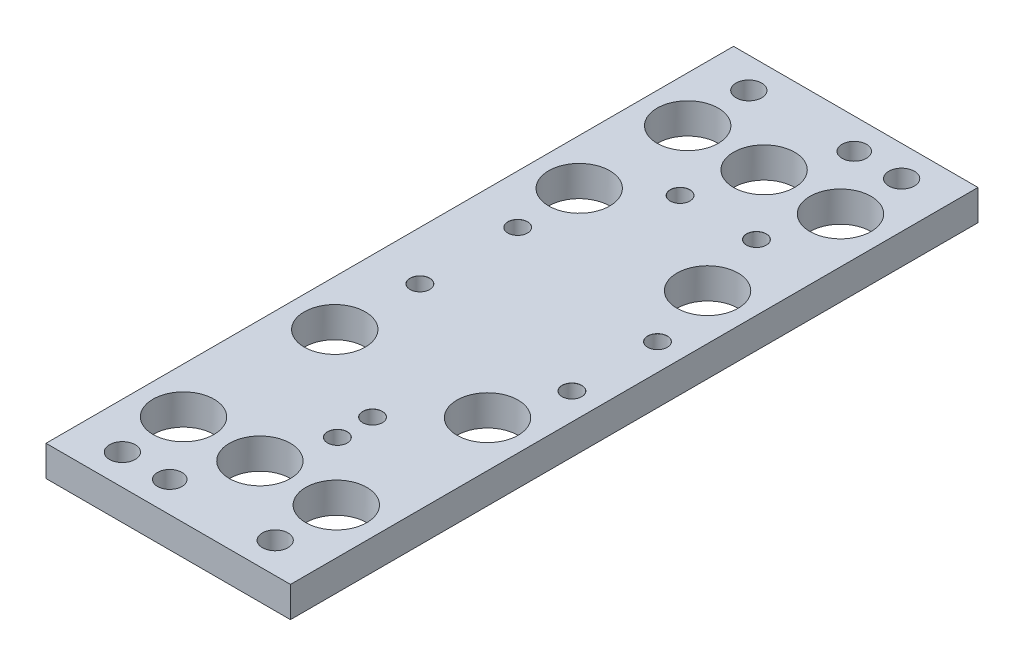
ISO-10303-21;
HEADER;
FILE_DESCRIPTION(('STEP AP214'),'2;1');
FILE_NAME('part.step','',(''),(''),'','','');
FILE_SCHEMA(('AUTOMOTIVE_DESIGN { 1 0 10303 214 1 1 1 1 }'));
ENDSEC;
DATA;
#1=APPLICATION_CONTEXT('core data for automotive mechanical design processes');
#2=APPLICATION_PROTOCOL_DEFINITION('international standard','automotive_design',2000,#1);
#3=PRODUCT_CONTEXT('',#1,'mechanical');
#4=PRODUCT('Part','Part','',(#3));
#5=PRODUCT_RELATED_PRODUCT_CATEGORY('part','',(#4));
#6=PRODUCT_DEFINITION_FORMATION('','',#4);
#7=PRODUCT_DEFINITION_CONTEXT('part definition',#1,'design');
#8=PRODUCT_DEFINITION('design','',#6,#7);
#9=PRODUCT_DEFINITION_SHAPE('','',#8);
#10=(LENGTH_UNIT() NAMED_UNIT(*) SI_UNIT(.MILLI.,.METRE.));
#11=(NAMED_UNIT(*) PLANE_ANGLE_UNIT() SI_UNIT($,.RADIAN.));
#12=(NAMED_UNIT(*) SI_UNIT($,.STERADIAN.) SOLID_ANGLE_UNIT());
#13=UNCERTAINTY_MEASURE_WITH_UNIT(LENGTH_MEASURE(1.E-05),#10,'distance_accuracy_value','');
#14=(GEOMETRIC_REPRESENTATION_CONTEXT(3) GLOBAL_UNCERTAINTY_ASSIGNED_CONTEXT((#13)) GLOBAL_UNIT_ASSIGNED_CONTEXT((#10,
#11,#12)) REPRESENTATION_CONTEXT('',''));
#15=CARTESIAN_POINT('',(0.,0.,0.));
#16=DIRECTION('',(0.,0.,1.));
#17=DIRECTION('',(1.,0.,0.));
#18=AXIS2_PLACEMENT_3D('',#15,#16,#17);
#19=CARTESIAN_POINT('',(40.,-10.,112.5));
#20=DIRECTION('',(1.,0.,0.));
#21=DIRECTION('',(0.,0.,-1.));
#22=AXIS2_PLACEMENT_3D('',#19,#20,#21);
#23=PLANE('',#22);
#24=DIRECTION('',(0.,0.,-1.));
#25=VECTOR('',#24,1.);
#26=CARTESIAN_POINT('',(40.,0.,112.5));
#27=LINE('',#26,#25);
#28=CARTESIAN_POINT('',(40.,0.,112.5));
#29=VERTEX_POINT('',#28);
#30=CARTESIAN_POINT('',(40.,0.,-112.5));
#31=VERTEX_POINT('',#30);
#32=EDGE_CURVE('E105',#29,#31,#27,.T.);
#33=ORIENTED_EDGE('',*,*,#32,.F.);
#34=DIRECTION('',(0.,1.,0.));
#35=VECTOR('',#34,1.);
#36=CARTESIAN_POINT('',(40.,-10.,112.5));
#37=LINE('',#36,#35);
#38=CARTESIAN_POINT('',(40.,-10.,112.5));
#39=VERTEX_POINT('',#38);
#40=EDGE_CURVE('E11',#39,#29,#37,.T.);
#41=ORIENTED_EDGE('',*,*,#40,.F.);
#42=DIRECTION('',(0.,0.,-1.));
#43=VECTOR('',#42,1.);
#44=CARTESIAN_POINT('',(40.,-10.,112.5));
#45=LINE('',#44,#43);
#46=CARTESIAN_POINT('',(40.,-10.,-112.5));
#47=VERTEX_POINT('',#46);
#48=EDGE_CURVE('E98',#39,#47,#45,.T.);
#49=ORIENTED_EDGE('',*,*,#48,.T.);
#50=DIRECTION('',(0.,1.,0.));
#51=VECTOR('',#50,1.);
#52=CARTESIAN_POINT('',(40.,-10.,-112.5));
#53=LINE('',#52,#51);
#54=EDGE_CURVE('E43',#47,#31,#53,.T.);
#55=ORIENTED_EDGE('',*,*,#54,.T.);
#56=EDGE_LOOP('',(#33,#41,#49,#55));
#57=FACE_BOUND('',#56,.T.);
#58=ADVANCED_FACE('F40',(#57),#23,.T.);
#59=CARTESIAN_POINT('',(-40.,-10.,112.5));
#60=DIRECTION('',(0.,0.,1.));
#61=DIRECTION('',(1.,0.,0.));
#62=AXIS2_PLACEMENT_3D('',#59,#60,#61);
#63=PLANE('',#62);
#64=DIRECTION('',(1.,0.,0.));
#65=VECTOR('',#64,1.);
#66=CARTESIAN_POINT('',(-40.,0.,112.5));
#67=LINE('',#66,#65);
#68=CARTESIAN_POINT('',(-40.,0.,112.5));
#69=VERTEX_POINT('',#68);
#70=EDGE_CURVE('E100',#69,#29,#67,.T.);
#71=ORIENTED_EDGE('',*,*,#70,.F.);
#72=DIRECTION('',(0.,1.,0.));
#73=VECTOR('',#72,1.);
#74=CARTESIAN_POINT('',(-40.,-10.,112.5));
#75=LINE('',#74,#73);
#76=CARTESIAN_POINT('',(-40.,-10.,112.5));
#77=VERTEX_POINT('',#76);
#78=EDGE_CURVE('E49',#77,#69,#75,.T.);
#79=ORIENTED_EDGE('',*,*,#78,.F.);
#80=DIRECTION('',(1.,0.,0.));
#81=VECTOR('',#80,1.);
#82=CARTESIAN_POINT('',(-40.,-10.,112.5));
#83=LINE('',#82,#81);
#84=EDGE_CURVE('E95',#77,#39,#83,.T.);
#85=ORIENTED_EDGE('',*,*,#84,.T.);
#86=ORIENTED_EDGE('',*,*,#40,.T.);
#87=EDGE_LOOP('',(#71,#79,#85,#86));
#88=FACE_BOUND('',#87,.T.);
#89=ADVANCED_FACE('F116',(#88),#63,.T.);
#90=CARTESIAN_POINT('',(-40.,-10.,112.5));
#91=DIRECTION('',(-1.,0.,0.));
#92=DIRECTION('',(0.,0.,1.));
#93=AXIS2_PLACEMENT_3D('',#90,#91,#92);
#94=PLANE('',#93);
#95=DIRECTION('',(0.,0.,1.));
#96=VECTOR('',#95,1.);
#97=CARTESIAN_POINT('',(-40.,0.,112.5));
#98=LINE('',#97,#96);
#99=CARTESIAN_POINT('',(-40.,0.,-112.5));
#100=VERTEX_POINT('',#99);
#101=EDGE_CURVE('E90',#100,#69,#98,.T.);
#102=ORIENTED_EDGE('',*,*,#101,.F.);
#103=DIRECTION('',(0.,1.,0.));
#104=VECTOR('',#103,1.);
#105=CARTESIAN_POINT('',(-40.,-10.,-112.5));
#106=LINE('',#105,#104);
#107=CARTESIAN_POINT('',(-40.,-10.,-112.5));
#108=VERTEX_POINT('',#107);
#109=EDGE_CURVE('E85',#108,#100,#106,.T.);
#110=ORIENTED_EDGE('',*,*,#109,.F.);
#111=DIRECTION('',(0.,0.,1.));
#112=VECTOR('',#111,1.);
#113=CARTESIAN_POINT('',(-40.,-10.,112.5));
#114=LINE('',#113,#112);
#115=EDGE_CURVE('E88',#108,#77,#114,.T.);
#116=ORIENTED_EDGE('',*,*,#115,.T.);
#117=ORIENTED_EDGE('',*,*,#78,.T.);
#118=EDGE_LOOP('',(#102,#110,#116,#117));
#119=FACE_BOUND('',#118,.T.);
#120=ADVANCED_FACE('F87',(#119),#94,.T.);
#121=CARTESIAN_POINT('',(-40.,-10.,-112.5));
#122=DIRECTION('',(0.,0.,-1.));
#123=DIRECTION('',(-1.,0.,0.));
#124=AXIS2_PLACEMENT_3D('',#121,#122,#123);
#125=PLANE('',#124);
#126=DIRECTION('',(-1.,0.,0.));
#127=VECTOR('',#126,1.);
#128=CARTESIAN_POINT('',(-40.,0.,-112.5));
#129=LINE('',#128,#127);
#130=EDGE_CURVE('E108',#31,#100,#129,.T.);
#131=ORIENTED_EDGE('',*,*,#130,.F.);
#132=ORIENTED_EDGE('',*,*,#54,.F.);
#133=DIRECTION('',(-1.,0.,0.));
#134=VECTOR('',#133,1.);
#135=CARTESIAN_POINT('',(-40.,-10.,-112.5));
#136=LINE('',#135,#134);
#137=EDGE_CURVE('E94',#47,#108,#136,.T.);
#138=ORIENTED_EDGE('',*,*,#137,.T.);
#139=ORIENTED_EDGE('',*,*,#109,.T.);
#140=EDGE_LOOP('',(#131,#132,#138,#139));
#141=FACE_BOUND('',#140,.T.);
#142=ADVANCED_FACE('F97',(#141),#125,.T.);
#143=CARTESIAN_POINT('',(0.,-10.,0.));
#144=DIRECTION('',(0.,-1.,0.));
#145=DIRECTION('',(0.,0.,-1.));
#146=AXIS2_PLACEMENT_3D('',#143,#144,#145);
#147=PLANE('',#146);
#148=CARTESIAN_POINT('',(-24.0000000000002,-10.,6.1400000000053));
#149=DIRECTION('',(0.,1.,0.));
#150=DIRECTION('',(0.,0.,1.));
#151=AXIS2_PLACEMENT_3D('',#148,#149,#150);
#152=CIRCLE('',#151,3.2);
#153=CARTESIAN_POINT('',(-24.0000000000002,-10.,9.3400000000053));
#154=VERTEX_POINT('',#153);
#155=EDGE_CURVE('E275',#154,#154,#152,.T.);
#156=ORIENTED_EDGE('',*,*,#155,.T.);
#157=EDGE_LOOP('',(#156));
#158=FACE_BOUND('',#157,.T.);
#159=CARTESIAN_POINT('',(-24.0000000000002,-10.,-25.8599999999947));
#160=DIRECTION('',(0.,1.,0.));
#161=DIRECTION('',(0.,0.,1.));
#162=AXIS2_PLACEMENT_3D('',#159,#160,#161);
#163=CIRCLE('',#162,3.2);
#164=CARTESIAN_POINT('',(-24.0000000000002,-10.,-22.6599999999947));
#165=VERTEX_POINT('',#164);
#166=EDGE_CURVE('E285',#165,#165,#163,.T.);
#167=ORIENTED_EDGE('',*,*,#166,.T.);
#168=EDGE_LOOP('',(#167));
#169=FACE_BOUND('',#168,.T.);
#170=CARTESIAN_POINT('',(31.25,-10.,11.6400000000048));
#171=DIRECTION('',(0.,1.,0.));
#172=DIRECTION('',(0.,0.,1.));
#173=AXIS2_PLACEMENT_3D('',#170,#171,#172);
#174=CIRCLE('',#173,3.2);
#175=CARTESIAN_POINT('',(31.25,-10.,14.8400000000048));
#176=VERTEX_POINT('',#175);
#177=EDGE_CURVE('E294',#176,#176,#174,.T.);
#178=ORIENTED_EDGE('',*,*,#177,.T.);
#179=EDGE_LOOP('',(#178));
#180=FACE_BOUND('',#179,.T.);
#181=CARTESIAN_POINT('',(31.25,-10.,-16.3599999999952));
#182=DIRECTION('',(0.,1.,0.));
#183=DIRECTION('',(0.,0.,1.));
#184=AXIS2_PLACEMENT_3D('',#181,#182,#183);
#185=CIRCLE('',#184,3.2);
#186=CARTESIAN_POINT('',(31.25,-10.,-13.1599999999952));
#187=VERTEX_POINT('',#186);
#188=EDGE_CURVE('E303',#187,#187,#185,.T.);
#189=ORIENTED_EDGE('',*,*,#188,.T.);
#190=EDGE_LOOP('',(#189));
#191=FACE_BOUND('',#190,.T.);
#192=CARTESIAN_POINT('',(18.4999999999993,-10.,-61.4999999999951));
#193=DIRECTION('',(0.,1.,0.));
#194=DIRECTION('',(0.,0.,1.));
#195=AXIS2_PLACEMENT_3D('',#192,#193,#194);
#196=CIRCLE('',#195,3.2);
#197=CARTESIAN_POINT('',(18.4999999999993,-10.,-58.2999999999951));
#198=VERTEX_POINT('',#197);
#199=EDGE_CURVE('E312',#198,#198,#196,.T.);
#200=ORIENTED_EDGE('',*,*,#199,.T.);
#201=EDGE_LOOP('',(#200));
#202=FACE_BOUND('',#201,.T.);
#203=CARTESIAN_POINT('',(-6.50000000000066,-10.,-61.4999999999951));
#204=DIRECTION('',(0.,1.,0.));
#205=DIRECTION('',(0.,0.,1.));
#206=AXIS2_PLACEMENT_3D('',#203,#204,#205);
#207=CIRCLE('',#206,3.2);
#208=CARTESIAN_POINT('',(-6.50000000000066,-10.,-58.2999999999951));
#209=VERTEX_POINT('',#208);
#210=EDGE_CURVE('E321',#209,#209,#207,.T.);
#211=ORIENTED_EDGE('',*,*,#210,.T.);
#212=EDGE_LOOP('',(#211));
#213=FACE_BOUND('',#212,.T.);
#214=CARTESIAN_POINT('',(6.00000000000067,-10.,51.6400000000044));
#215=DIRECTION('',(0.,1.,0.));
#216=DIRECTION('',(0.,0.,1.));
#217=AXIS2_PLACEMENT_3D('',#214,#215,#216);
#218=CIRCLE('',#217,3.2);
#219=CARTESIAN_POINT('',(6.00000000000067,-10.,54.8400000000044));
#220=VERTEX_POINT('',#219);
#221=EDGE_CURVE('E330',#220,#220,#218,.T.);
#222=ORIENTED_EDGE('',*,*,#221,.T.);
#223=EDGE_LOOP('',(#222));
#224=FACE_BOUND('',#223,.T.);
#225=CARTESIAN_POINT('',(6.00000000000067,-10.,63.1400000000044));
#226=DIRECTION('',(0.,1.,0.));
#227=DIRECTION('',(0.,0.,1.));
#228=AXIS2_PLACEMENT_3D('',#225,#226,#227);
#229=CIRCLE('',#228,3.2);
#230=CARTESIAN_POINT('',(6.00000000000067,-10.,66.3400000000044));
#231=VERTEX_POINT('',#230);
#232=EDGE_CURVE('E339',#231,#231,#229,.T.);
#233=ORIENTED_EDGE('',*,*,#232,.T.);
#234=EDGE_LOOP('',(#233));
#235=FACE_BOUND('',#234,.T.);
#236=CARTESIAN_POINT('',(-9.49999999999999,-10.,102.5));
#237=DIRECTION('',(0.,1.,0.));
#238=DIRECTION('',(0.,0.,1.));
#239=AXIS2_PLACEMENT_3D('',#236,#237,#238);
#240=CIRCLE('',#239,4.);
#241=CARTESIAN_POINT('',(-9.49999999999999,-10.,106.5));
#242=VERTEX_POINT('',#241);
#243=EDGE_CURVE('E345',#242,#242,#240,.T.);
#244=ORIENTED_EDGE('',*,*,#243,.T.);
#245=EDGE_LOOP('',(#244));
#246=FACE_BOUND('',#245,.T.);
#247=CARTESIAN_POINT('',(9.5,-10.,-102.5));
#248=DIRECTION('',(0.,1.,0.));
#249=DIRECTION('',(0.,0.,1.));
#250=AXIS2_PLACEMENT_3D('',#247,#248,#249);
#251=CIRCLE('',#250,4.);
#252=CARTESIAN_POINT('',(9.5,-10.,-98.5));
#253=VERTEX_POINT('',#252);
#254=EDGE_CURVE('E351',#253,#253,#251,.T.);
#255=ORIENTED_EDGE('',*,*,#254,.T.);
#256=EDGE_LOOP('',(#255));
#257=FACE_BOUND('',#256,.T.);
#258=CARTESIAN_POINT('',(25.,-10.,102.5));
#259=DIRECTION('',(0.,1.,0.));
#260=DIRECTION('',(0.,0.,1.));
#261=AXIS2_PLACEMENT_3D('',#258,#259,#260);
#262=CIRCLE('',#261,4.2);
#263=CARTESIAN_POINT('',(25.,-10.,106.7));
#264=VERTEX_POINT('',#263);
#265=EDGE_CURVE('E357',#264,#264,#262,.T.);
#266=ORIENTED_EDGE('',*,*,#265,.T.);
#267=EDGE_LOOP('',(#266));
#268=FACE_BOUND('',#267,.T.);
#269=CARTESIAN_POINT('',(-25.,-10.,102.5));
#270=DIRECTION('',(0.,1.,0.));
#271=DIRECTION('',(0.,0.,1.));
#272=AXIS2_PLACEMENT_3D('',#269,#270,#271);
#273=CIRCLE('',#272,4.2);
#274=CARTESIAN_POINT('',(-25.,-10.,106.7));
#275=VERTEX_POINT('',#274);
#276=EDGE_CURVE('E363',#275,#275,#273,.T.);
#277=ORIENTED_EDGE('',*,*,#276,.T.);
#278=EDGE_LOOP('',(#277));
#279=FACE_BOUND('',#278,.T.);
#280=CARTESIAN_POINT('',(25.,-10.,-102.5));
#281=DIRECTION('',(0.,1.,0.));
#282=DIRECTION('',(0.,0.,1.));
#283=AXIS2_PLACEMENT_3D('',#280,#281,#282);
#284=CIRCLE('',#283,4.2);
#285=CARTESIAN_POINT('',(25.,-10.,-98.3));
#286=VERTEX_POINT('',#285);
#287=EDGE_CURVE('E369',#286,#286,#284,.T.);
#288=ORIENTED_EDGE('',*,*,#287,.T.);
#289=EDGE_LOOP('',(#288));
#290=FACE_BOUND('',#289,.T.);
#291=CARTESIAN_POINT('',(-25.,-10.,-102.5));
#292=DIRECTION('',(0.,1.,0.));
#293=DIRECTION('',(0.,0.,1.));
#294=AXIS2_PLACEMENT_3D('',#291,#292,#293);
#295=CIRCLE('',#294,4.2);
#296=CARTESIAN_POINT('',(-25.,-10.,-98.3));
#297=VERTEX_POINT('',#296);
#298=EDGE_CURVE('E375',#297,#297,#295,.T.);
#299=ORIENTED_EDGE('',*,*,#298,.T.);
#300=EDGE_LOOP('',(#299));
#301=FACE_BOUND('',#300,.T.);
#302=CARTESIAN_POINT('',(0.,-10.,82.5));
#303=DIRECTION('',(0.,-1.,0.));
#304=DIRECTION('',(0.,0.,-1.));
#305=AXIS2_PLACEMENT_3D('',#302,#303,#304);
#306=CIRCLE('',#305,9.99999999999999);
#307=CARTESIAN_POINT('',(0.,-10.,72.5));
#308=VERTEX_POINT('',#307);
#309=EDGE_CURVE('E385',#308,#308,#306,.F.);
#310=ORIENTED_EDGE('',*,*,#309,.T.);
#311=EDGE_LOOP('',(#310));
#312=FACE_BOUND('',#311,.T.);
#313=CARTESIAN_POINT('',(-25.,-10.,82.5));
#314=DIRECTION('',(0.,-1.,0.));
#315=DIRECTION('',(0.,0.,-1.));
#316=AXIS2_PLACEMENT_3D('',#313,#314,#315);
#317=CIRCLE('',#316,9.99999999999999);
#318=CARTESIAN_POINT('',(-25.,-10.,72.5));
#319=VERTEX_POINT('',#318);
#320=EDGE_CURVE('E392',#319,#319,#317,.F.);
#321=ORIENTED_EDGE('',*,*,#320,.T.);
#322=EDGE_LOOP('',(#321));
#323=FACE_BOUND('',#322,.T.);
#324=CARTESIAN_POINT('',(25.,-10.,33.));
#325=DIRECTION('',(0.,-1.,0.));
#326=DIRECTION('',(0.,0.,-1.));
#327=AXIS2_PLACEMENT_3D('',#324,#325,#326);
#328=CIRCLE('',#327,10.);
#329=CARTESIAN_POINT('',(25.,-10.,23.));
#330=VERTEX_POINT('',#329);
#331=EDGE_CURVE('E398',#330,#330,#328,.F.);
#332=ORIENTED_EDGE('',*,*,#331,.T.);
#333=EDGE_LOOP('',(#332));
#334=FACE_BOUND('',#333,.T.);
#335=CARTESIAN_POINT('',(-25.,-10.,33.));
#336=DIRECTION('',(0.,-1.,0.));
#337=DIRECTION('',(0.,0.,-1.));
#338=AXIS2_PLACEMENT_3D('',#335,#336,#337);
#339=CIRCLE('',#338,10.);
#340=CARTESIAN_POINT('',(-25.,-10.,23.));
#341=VERTEX_POINT('',#340);
#342=EDGE_CURVE('E404',#341,#341,#339,.F.);
#343=ORIENTED_EDGE('',*,*,#342,.T.);
#344=EDGE_LOOP('',(#343));
#345=FACE_BOUND('',#344,.T.);
#346=CARTESIAN_POINT('',(25.,-10.,-39.));
#347=DIRECTION('',(0.,-1.,0.));
#348=DIRECTION('',(0.,0.,-1.));
#349=AXIS2_PLACEMENT_3D('',#346,#347,#348);
#350=CIRCLE('',#349,10.);
#351=CARTESIAN_POINT('',(25.,-10.,-49.));
#352=VERTEX_POINT('',#351);
#353=EDGE_CURVE('E410',#352,#352,#350,.F.);
#354=ORIENTED_EDGE('',*,*,#353,.T.);
#355=EDGE_LOOP('',(#354));
#356=FACE_BOUND('',#355,.T.);
#357=CARTESIAN_POINT('',(-25.,-10.,-47.));
#358=DIRECTION('',(0.,-1.,0.));
#359=DIRECTION('',(0.,0.,-1.));
#360=AXIS2_PLACEMENT_3D('',#357,#358,#359);
#361=CIRCLE('',#360,10.);
#362=CARTESIAN_POINT('',(-25.,-10.,-57.));
#363=VERTEX_POINT('',#362);
#364=EDGE_CURVE('E416',#363,#363,#361,.F.);
#365=ORIENTED_EDGE('',*,*,#364,.T.);
#366=EDGE_LOOP('',(#365));
#367=FACE_BOUND('',#366,.T.);
#368=CARTESIAN_POINT('',(-25.,-10.,-82.5));
#369=DIRECTION('',(0.,-1.,0.));
#370=DIRECTION('',(0.,0.,-1.));
#371=AXIS2_PLACEMENT_3D('',#368,#369,#370);
#372=CIRCLE('',#371,9.99999999999999);
#373=CARTESIAN_POINT('',(-25.,-10.,-92.5));
#374=VERTEX_POINT('',#373);
#375=EDGE_CURVE('E422',#374,#374,#372,.F.);
#376=ORIENTED_EDGE('',*,*,#375,.T.);
#377=EDGE_LOOP('',(#376));
#378=FACE_BOUND('',#377,.T.);
#379=CARTESIAN_POINT('',(0.,-10.,-82.5));
#380=DIRECTION('',(0.,-1.,0.));
#381=DIRECTION('',(0.,0.,-1.));
#382=AXIS2_PLACEMENT_3D('',#379,#380,#381);
#383=CIRCLE('',#382,9.99999999999999);
#384=CARTESIAN_POINT('',(0.,-10.,-92.5));
#385=VERTEX_POINT('',#384);
#386=EDGE_CURVE('E428',#385,#385,#383,.F.);
#387=ORIENTED_EDGE('',*,*,#386,.T.);
#388=EDGE_LOOP('',(#387));
#389=FACE_BOUND('',#388,.T.);
#390=CARTESIAN_POINT('',(25.,-10.,-82.5));
#391=DIRECTION('',(0.,-1.,0.));
#392=DIRECTION('',(0.,0.,-1.));
#393=AXIS2_PLACEMENT_3D('',#390,#391,#392);
#394=CIRCLE('',#393,9.99999999999999);
#395=CARTESIAN_POINT('',(25.,-10.,-92.5));
#396=VERTEX_POINT('',#395);
#397=EDGE_CURVE('E379',#396,#396,#394,.F.);
#398=ORIENTED_EDGE('',*,*,#397,.T.);
#399=EDGE_LOOP('',(#398));
#400=FACE_BOUND('',#399,.T.);
#401=CARTESIAN_POINT('',(25.,-10.,82.5));
#402=DIRECTION('',(0.,-1.,0.));
#403=DIRECTION('',(0.,0.,-1.));
#404=AXIS2_PLACEMENT_3D('',#401,#402,#403);
#405=CIRCLE('',#404,9.99999999999999);
#406=CARTESIAN_POINT('',(25.,-10.,72.5));
#407=VERTEX_POINT('',#406);
#408=EDGE_CURVE('E388',#407,#407,#405,.F.);
#409=ORIENTED_EDGE('',*,*,#408,.T.);
#410=EDGE_LOOP('',(#409));
#411=FACE_BOUND('',#410,.T.);
#412=ORIENTED_EDGE('',*,*,#48,.F.);
#413=ORIENTED_EDGE('',*,*,#84,.F.);
#414=ORIENTED_EDGE('',*,*,#115,.F.);
#415=ORIENTED_EDGE('',*,*,#137,.F.);
#416=EDGE_LOOP('',(#412,#413,#414,#415));
#417=FACE_BOUND('',#416,.T.);
#418=ADVANCED_FACE('F93',(#158,#169,#180,#191,#202,#213,#224,#235,#246,#257,#268,#279,#290,#301,
#312,#323,#334,#345,#356,#367,#378,#389,#400,#411,#417),#147,.T.);
#419=CARTESIAN_POINT('',(0.,0.,0.));
#420=DIRECTION('',(0.,-1.,0.));
#421=DIRECTION('',(0.,0.,-1.));
#422=AXIS2_PLACEMENT_3D('',#419,#420,#421);
#423=PLANE('',#422);
#424=CARTESIAN_POINT('',(-24.0000000000002,0.,6.1400000000053));
#425=DIRECTION('',(0.,1.,0.));
#426=DIRECTION('',(0.,0.,1.));
#427=AXIS2_PLACEMENT_3D('',#424,#425,#426);
#428=CIRCLE('',#427,3.225);
#429=CARTESIAN_POINT('',(-24.0000000000002,0.,9.3650000000053));
#430=VERTEX_POINT('',#429);
#431=EDGE_CURVE('E273',#430,#430,#428,.T.);
#432=ORIENTED_EDGE('',*,*,#431,.F.);
#433=EDGE_LOOP('',(#432));
#434=FACE_BOUND('',#433,.T.);
#435=CARTESIAN_POINT('',(-24.0000000000002,0.,-25.8599999999947));
#436=DIRECTION('',(0.,1.,0.));
#437=DIRECTION('',(0.,0.,1.));
#438=AXIS2_PLACEMENT_3D('',#435,#436,#437);
#439=CIRCLE('',#438,3.225);
#440=CARTESIAN_POINT('',(-24.0000000000002,0.,-22.6349999999947));
#441=VERTEX_POINT('',#440);
#442=EDGE_CURVE('E279',#441,#441,#439,.T.);
#443=ORIENTED_EDGE('',*,*,#442,.F.);
#444=EDGE_LOOP('',(#443));
#445=FACE_BOUND('',#444,.T.);
#446=CARTESIAN_POINT('',(31.25,0.,11.6400000000048));
#447=DIRECTION('',(0.,1.,0.));
#448=DIRECTION('',(0.,0.,1.));
#449=AXIS2_PLACEMENT_3D('',#446,#447,#448);
#450=CIRCLE('',#449,3.225);
#451=CARTESIAN_POINT('',(31.25,0.,14.8650000000048));
#452=VERTEX_POINT('',#451);
#453=EDGE_CURVE('E288',#452,#452,#450,.T.);
#454=ORIENTED_EDGE('',*,*,#453,.F.);
#455=EDGE_LOOP('',(#454));
#456=FACE_BOUND('',#455,.T.);
#457=CARTESIAN_POINT('',(31.25,0.,-16.3599999999952));
#458=DIRECTION('',(0.,1.,0.));
#459=DIRECTION('',(0.,0.,1.));
#460=AXIS2_PLACEMENT_3D('',#457,#458,#459);
#461=CIRCLE('',#460,3.225);
#462=CARTESIAN_POINT('',(31.25,0.,-13.1349999999952));
#463=VERTEX_POINT('',#462);
#464=EDGE_CURVE('E297',#463,#463,#461,.T.);
#465=ORIENTED_EDGE('',*,*,#464,.F.);
#466=EDGE_LOOP('',(#465));
#467=FACE_BOUND('',#466,.T.);
#468=CARTESIAN_POINT('',(18.4999999999993,0.,-61.4999999999951));
#469=DIRECTION('',(0.,1.,0.));
#470=DIRECTION('',(0.,0.,1.));
#471=AXIS2_PLACEMENT_3D('',#468,#469,#470);
#472=CIRCLE('',#471,3.225);
#473=CARTESIAN_POINT('',(18.4999999999993,0.,-58.2749999999951));
#474=VERTEX_POINT('',#473);
#475=EDGE_CURVE('E306',#474,#474,#472,.T.);
#476=ORIENTED_EDGE('',*,*,#475,.F.);
#477=EDGE_LOOP('',(#476));
#478=FACE_BOUND('',#477,.T.);
#479=CARTESIAN_POINT('',(-6.50000000000066,0.,-61.4999999999951));
#480=DIRECTION('',(0.,1.,0.));
#481=DIRECTION('',(0.,0.,1.));
#482=AXIS2_PLACEMENT_3D('',#479,#480,#481);
#483=CIRCLE('',#482,3.225);
#484=CARTESIAN_POINT('',(-6.50000000000066,0.,-58.2749999999951));
#485=VERTEX_POINT('',#484);
#486=EDGE_CURVE('E315',#485,#485,#483,.T.);
#487=ORIENTED_EDGE('',*,*,#486,.F.);
#488=EDGE_LOOP('',(#487));
#489=FACE_BOUND('',#488,.T.);
#490=CARTESIAN_POINT('',(6.00000000000067,0.,51.6400000000044));
#491=DIRECTION('',(0.,1.,0.));
#492=DIRECTION('',(0.,0.,1.));
#493=AXIS2_PLACEMENT_3D('',#490,#491,#492);
#494=CIRCLE('',#493,3.225);
#495=CARTESIAN_POINT('',(6.00000000000067,0.,54.8650000000044));
#496=VERTEX_POINT('',#495);
#497=EDGE_CURVE('E324',#496,#496,#494,.T.);
#498=ORIENTED_EDGE('',*,*,#497,.F.);
#499=EDGE_LOOP('',(#498));
#500=FACE_BOUND('',#499,.T.);
#501=CARTESIAN_POINT('',(6.00000000000067,0.,63.1400000000044));
#502=DIRECTION('',(0.,1.,0.));
#503=DIRECTION('',(0.,0.,1.));
#504=AXIS2_PLACEMENT_3D('',#501,#502,#503);
#505=CIRCLE('',#504,3.225);
#506=CARTESIAN_POINT('',(6.00000000000067,0.,66.3650000000044));
#507=VERTEX_POINT('',#506);
#508=EDGE_CURVE('E333',#507,#507,#505,.T.);
#509=ORIENTED_EDGE('',*,*,#508,.F.);
#510=EDGE_LOOP('',(#509));
#511=FACE_BOUND('',#510,.T.);
#512=CARTESIAN_POINT('',(-9.49999999999999,0.,102.5));
#513=DIRECTION('',(0.,1.,0.));
#514=DIRECTION('',(0.,0.,1.));
#515=AXIS2_PLACEMENT_3D('',#512,#513,#514);
#516=CIRCLE('',#515,4.);
#517=CARTESIAN_POINT('',(-9.49999999999999,0.,106.5));
#518=VERTEX_POINT('',#517);
#519=EDGE_CURVE('E342',#518,#518,#516,.T.);
#520=ORIENTED_EDGE('',*,*,#519,.F.);
#521=EDGE_LOOP('',(#520));
#522=FACE_BOUND('',#521,.T.);
#523=CARTESIAN_POINT('',(9.5,0.,-102.5));
#524=DIRECTION('',(0.,1.,0.));
#525=DIRECTION('',(0.,0.,1.));
#526=AXIS2_PLACEMENT_3D('',#523,#524,#525);
#527=CIRCLE('',#526,4.);
#528=CARTESIAN_POINT('',(9.5,0.,-98.5));
#529=VERTEX_POINT('',#528);
#530=EDGE_CURVE('E348',#529,#529,#527,.T.);
#531=ORIENTED_EDGE('',*,*,#530,.F.);
#532=EDGE_LOOP('',(#531));
#533=FACE_BOUND('',#532,.T.);
#534=CARTESIAN_POINT('',(25.,0.,102.5));
#535=DIRECTION('',(0.,1.,0.));
#536=DIRECTION('',(0.,0.,1.));
#537=AXIS2_PLACEMENT_3D('',#534,#535,#536);
#538=CIRCLE('',#537,4.19999999999999);
#539=CARTESIAN_POINT('',(25.,0.,106.7));
#540=VERTEX_POINT('',#539);
#541=EDGE_CURVE('E354',#540,#540,#538,.T.);
#542=ORIENTED_EDGE('',*,*,#541,.F.);
#543=EDGE_LOOP('',(#542));
#544=FACE_BOUND('',#543,.T.);
#545=CARTESIAN_POINT('',(-25.,0.,102.5));
#546=DIRECTION('',(0.,1.,0.));
#547=DIRECTION('',(0.,0.,1.));
#548=AXIS2_PLACEMENT_3D('',#545,#546,#547);
#549=CIRCLE('',#548,4.19999999999999);
#550=CARTESIAN_POINT('',(-25.,0.,106.7));
#551=VERTEX_POINT('',#550);
#552=EDGE_CURVE('E360',#551,#551,#549,.T.);
#553=ORIENTED_EDGE('',*,*,#552,.F.);
#554=EDGE_LOOP('',(#553));
#555=FACE_BOUND('',#554,.T.);
#556=CARTESIAN_POINT('',(25.,0.,-102.5));
#557=DIRECTION('',(0.,1.,0.));
#558=DIRECTION('',(0.,0.,1.));
#559=AXIS2_PLACEMENT_3D('',#556,#557,#558);
#560=CIRCLE('',#559,4.19999999999999);
#561=CARTESIAN_POINT('',(25.,0.,-98.3));
#562=VERTEX_POINT('',#561);
#563=EDGE_CURVE('E366',#562,#562,#560,.T.);
#564=ORIENTED_EDGE('',*,*,#563,.F.);
#565=EDGE_LOOP('',(#564));
#566=FACE_BOUND('',#565,.T.);
#567=CARTESIAN_POINT('',(-25.,0.,-102.5));
#568=DIRECTION('',(0.,1.,0.));
#569=DIRECTION('',(0.,0.,1.));
#570=AXIS2_PLACEMENT_3D('',#567,#568,#569);
#571=CIRCLE('',#570,4.19999999999999);
#572=CARTESIAN_POINT('',(-25.,0.,-98.3));
#573=VERTEX_POINT('',#572);
#574=EDGE_CURVE('E372',#573,#573,#571,.T.);
#575=ORIENTED_EDGE('',*,*,#574,.F.);
#576=EDGE_LOOP('',(#575));
#577=FACE_BOUND('',#576,.T.);
#578=CARTESIAN_POINT('',(0.,0.,82.5));
#579=DIRECTION('',(0.,1.,0.));
#580=DIRECTION('',(0.,0.,1.));
#581=AXIS2_PLACEMENT_3D('',#578,#579,#580);
#582=CIRCLE('',#581,9.99999999999999);
#583=CARTESIAN_POINT('',(0.,0.,92.5));
#584=VERTEX_POINT('',#583);
#585=EDGE_CURVE('E389',#584,#584,#582,.T.);
#586=ORIENTED_EDGE('',*,*,#585,.F.);
#587=EDGE_LOOP('',(#586));
#588=FACE_BOUND('',#587,.T.);
#589=CARTESIAN_POINT('',(-25.,0.,82.5));
#590=DIRECTION('',(0.,1.,0.));
#591=DIRECTION('',(0.,0.,1.));
#592=AXIS2_PLACEMENT_3D('',#589,#590,#591);
#593=CIRCLE('',#592,9.99999999999999);
#594=CARTESIAN_POINT('',(-25.,0.,92.5));
#595=VERTEX_POINT('',#594);
#596=EDGE_CURVE('E395',#595,#595,#593,.T.);
#597=ORIENTED_EDGE('',*,*,#596,.F.);
#598=EDGE_LOOP('',(#597));
#599=FACE_BOUND('',#598,.T.);
#600=CARTESIAN_POINT('',(25.,0.,33.));
#601=DIRECTION('',(0.,1.,0.));
#602=DIRECTION('',(0.,0.,1.));
#603=AXIS2_PLACEMENT_3D('',#600,#601,#602);
#604=CIRCLE('',#603,10.);
#605=CARTESIAN_POINT('',(25.,0.,43.));
#606=VERTEX_POINT('',#605);
#607=EDGE_CURVE('E401',#606,#606,#604,.T.);
#608=ORIENTED_EDGE('',*,*,#607,.F.);
#609=EDGE_LOOP('',(#608));
#610=FACE_BOUND('',#609,.T.);
#611=CARTESIAN_POINT('',(-25.,0.,33.));
#612=DIRECTION('',(0.,1.,0.));
#613=DIRECTION('',(0.,0.,1.));
#614=AXIS2_PLACEMENT_3D('',#611,#612,#613);
#615=CIRCLE('',#614,10.);
#616=CARTESIAN_POINT('',(-25.,0.,43.));
#617=VERTEX_POINT('',#616);
#618=EDGE_CURVE('E407',#617,#617,#615,.T.);
#619=ORIENTED_EDGE('',*,*,#618,.F.);
#620=EDGE_LOOP('',(#619));
#621=FACE_BOUND('',#620,.T.);
#622=CARTESIAN_POINT('',(25.,0.,-39.));
#623=DIRECTION('',(0.,1.,0.));
#624=DIRECTION('',(0.,0.,1.));
#625=AXIS2_PLACEMENT_3D('',#622,#623,#624);
#626=CIRCLE('',#625,10.);
#627=CARTESIAN_POINT('',(25.,0.,-29.));
#628=VERTEX_POINT('',#627);
#629=EDGE_CURVE('E413',#628,#628,#626,.T.);
#630=ORIENTED_EDGE('',*,*,#629,.F.);
#631=EDGE_LOOP('',(#630));
#632=FACE_BOUND('',#631,.T.);
#633=CARTESIAN_POINT('',(-25.,0.,-47.));
#634=DIRECTION('',(0.,1.,0.));
#635=DIRECTION('',(0.,0.,1.));
#636=AXIS2_PLACEMENT_3D('',#633,#634,#635);
#637=CIRCLE('',#636,10.);
#638=CARTESIAN_POINT('',(-25.,0.,-37.));
#639=VERTEX_POINT('',#638);
#640=EDGE_CURVE('E419',#639,#639,#637,.T.);
#641=ORIENTED_EDGE('',*,*,#640,.F.);
#642=EDGE_LOOP('',(#641));
#643=FACE_BOUND('',#642,.T.);
#644=CARTESIAN_POINT('',(-25.,0.,-82.5));
#645=DIRECTION('',(0.,1.,0.));
#646=DIRECTION('',(0.,0.,1.));
#647=AXIS2_PLACEMENT_3D('',#644,#645,#646);
#648=CIRCLE('',#647,9.99999999999999);
#649=CARTESIAN_POINT('',(-25.,0.,-72.5));
#650=VERTEX_POINT('',#649);
#651=EDGE_CURVE('E425',#650,#650,#648,.T.);
#652=ORIENTED_EDGE('',*,*,#651,.F.);
#653=EDGE_LOOP('',(#652));
#654=FACE_BOUND('',#653,.T.);
#655=CARTESIAN_POINT('',(0.,0.,-82.5));
#656=DIRECTION('',(0.,1.,0.));
#657=DIRECTION('',(0.,0.,1.));
#658=AXIS2_PLACEMENT_3D('',#655,#656,#657);
#659=CIRCLE('',#658,9.99999999999999);
#660=CARTESIAN_POINT('',(0.,0.,-72.5));
#661=VERTEX_POINT('',#660);
#662=EDGE_CURVE('E382',#661,#661,#659,.T.);
#663=ORIENTED_EDGE('',*,*,#662,.F.);
#664=EDGE_LOOP('',(#663));
#665=FACE_BOUND('',#664,.T.);
#666=CARTESIAN_POINT('',(25.,0.,-82.5));
#667=DIRECTION('',(0.,1.,0.));
#668=DIRECTION('',(0.,0.,1.));
#669=AXIS2_PLACEMENT_3D('',#666,#667,#668);
#670=CIRCLE('',#669,9.99999999999999);
#671=CARTESIAN_POINT('',(25.,0.,-72.5));
#672=VERTEX_POINT('',#671);
#673=EDGE_CURVE('E378',#672,#672,#670,.T.);
#674=ORIENTED_EDGE('',*,*,#673,.F.);
#675=EDGE_LOOP('',(#674));
#676=FACE_BOUND('',#675,.T.);
#677=CARTESIAN_POINT('',(25.,0.,82.5));
#678=DIRECTION('',(0.,1.,0.));
#679=DIRECTION('',(0.,0.,1.));
#680=AXIS2_PLACEMENT_3D('',#677,#678,#679);
#681=CIRCLE('',#680,9.99999999999999);
#682=CARTESIAN_POINT('',(25.,0.,92.5));
#683=VERTEX_POINT('',#682);
#684=EDGE_CURVE('E109',#683,#683,#681,.T.);
#685=ORIENTED_EDGE('',*,*,#684,.F.);
#686=EDGE_LOOP('',(#685));
#687=FACE_BOUND('',#686,.T.);
#688=ORIENTED_EDGE('',*,*,#32,.T.);
#689=ORIENTED_EDGE('',*,*,#130,.T.);
#690=ORIENTED_EDGE('',*,*,#101,.T.);
#691=ORIENTED_EDGE('',*,*,#70,.T.);
#692=EDGE_LOOP('',(#688,#689,#690,#691));
#693=FACE_BOUND('',#692,.T.);
#694=ADVANCED_FACE('F115',(#434,#445,#456,#467,#478,#489,#500,#511,#522,#533,#544,#555,#566,
#577,#588,#599,#610,#621,#632,#643,#654,#665,#676,#687,#693),#423,.F.);
#695=CARTESIAN_POINT('',(25.,-10.001,82.5));
#696=DIRECTION('',(0.,1.,0.));
#697=DIRECTION('',(0.,0.,1.));
#698=AXIS2_PLACEMENT_3D('',#695,#696,#697);
#699=CYLINDRICAL_SURFACE('',#698,9.99999999999999);
#700=ORIENTED_EDGE('',*,*,#408,.F.);
#701=EDGE_LOOP('',(#700));
#702=FACE_BOUND('',#701,.T.);
#703=ORIENTED_EDGE('',*,*,#684,.T.);
#704=EDGE_LOOP('',(#703));
#705=FACE_BOUND('',#704,.T.);
#706=ADVANCED_FACE('F136',(#702,#705),#699,.F.);
#707=CARTESIAN_POINT('',(25.,-10.001,-82.5));
#708=DIRECTION('',(0.,1.,0.));
#709=DIRECTION('',(0.,0.,1.));
#710=AXIS2_PLACEMENT_3D('',#707,#708,#709);
#711=CYLINDRICAL_SURFACE('',#710,9.99999999999999);
#712=ORIENTED_EDGE('',*,*,#397,.F.);
#713=EDGE_LOOP('',(#712));
#714=FACE_BOUND('',#713,.T.);
#715=ORIENTED_EDGE('',*,*,#673,.T.);
#716=EDGE_LOOP('',(#715));
#717=FACE_BOUND('',#716,.T.);
#718=ADVANCED_FACE('F142',(#714,#717),#711,.F.);
#719=CARTESIAN_POINT('',(0.,-10.001,-82.5));
#720=DIRECTION('',(0.,1.,0.));
#721=DIRECTION('',(0.,0.,1.));
#722=AXIS2_PLACEMENT_3D('',#719,#720,#721);
#723=CYLINDRICAL_SURFACE('',#722,9.99999999999999);
#724=ORIENTED_EDGE('',*,*,#386,.F.);
#725=EDGE_LOOP('',(#724));
#726=FACE_BOUND('',#725,.T.);
#727=ORIENTED_EDGE('',*,*,#662,.T.);
#728=EDGE_LOOP('',(#727));
#729=FACE_BOUND('',#728,.T.);
#730=ADVANCED_FACE('F144',(#726,#729),#723,.F.);
#731=CARTESIAN_POINT('',(-25.,-10.001,-82.5));
#732=DIRECTION('',(0.,1.,0.));
#733=DIRECTION('',(0.,0.,1.));
#734=AXIS2_PLACEMENT_3D('',#731,#732,#733);
#735=CYLINDRICAL_SURFACE('',#734,9.99999999999999);
#736=ORIENTED_EDGE('',*,*,#375,.F.);
#737=EDGE_LOOP('',(#736));
#738=FACE_BOUND('',#737,.T.);
#739=ORIENTED_EDGE('',*,*,#651,.T.);
#740=EDGE_LOOP('',(#739));
#741=FACE_BOUND('',#740,.T.);
#742=ADVANCED_FACE('F147',(#738,#741),#735,.F.);
#743=CARTESIAN_POINT('',(-25.,-10.001,-47.));
#744=DIRECTION('',(0.,1.,0.));
#745=DIRECTION('',(0.,0.,1.));
#746=AXIS2_PLACEMENT_3D('',#743,#744,#745);
#747=CYLINDRICAL_SURFACE('',#746,10.);
#748=ORIENTED_EDGE('',*,*,#364,.F.);
#749=EDGE_LOOP('',(#748));
#750=FACE_BOUND('',#749,.T.);
#751=ORIENTED_EDGE('',*,*,#640,.T.);
#752=EDGE_LOOP('',(#751));
#753=FACE_BOUND('',#752,.T.);
#754=ADVANCED_FACE('F151',(#750,#753),#747,.F.);
#755=CARTESIAN_POINT('',(25.,-10.001,-39.));
#756=DIRECTION('',(0.,1.,0.));
#757=DIRECTION('',(0.,0.,1.));
#758=AXIS2_PLACEMENT_3D('',#755,#756,#757);
#759=CYLINDRICAL_SURFACE('',#758,10.);
#760=ORIENTED_EDGE('',*,*,#353,.F.);
#761=EDGE_LOOP('',(#760));
#762=FACE_BOUND('',#761,.T.);
#763=ORIENTED_EDGE('',*,*,#629,.T.);
#764=EDGE_LOOP('',(#763));
#765=FACE_BOUND('',#764,.T.);
#766=ADVANCED_FACE('F155',(#762,#765),#759,.F.);
#767=CARTESIAN_POINT('',(-25.,-10.001,33.));
#768=DIRECTION('',(0.,1.,0.));
#769=DIRECTION('',(0.,0.,1.));
#770=AXIS2_PLACEMENT_3D('',#767,#768,#769);
#771=CYLINDRICAL_SURFACE('',#770,10.);
#772=ORIENTED_EDGE('',*,*,#342,.F.);
#773=EDGE_LOOP('',(#772));
#774=FACE_BOUND('',#773,.T.);
#775=ORIENTED_EDGE('',*,*,#618,.T.);
#776=EDGE_LOOP('',(#775));
#777=FACE_BOUND('',#776,.T.);
#778=ADVANCED_FACE('F159',(#774,#777),#771,.F.);
#779=CARTESIAN_POINT('',(25.,-10.001,33.));
#780=DIRECTION('',(0.,1.,0.));
#781=DIRECTION('',(0.,0.,1.));
#782=AXIS2_PLACEMENT_3D('',#779,#780,#781);
#783=CYLINDRICAL_SURFACE('',#782,10.);
#784=ORIENTED_EDGE('',*,*,#331,.F.);
#785=EDGE_LOOP('',(#784));
#786=FACE_BOUND('',#785,.T.);
#787=ORIENTED_EDGE('',*,*,#607,.T.);
#788=EDGE_LOOP('',(#787));
#789=FACE_BOUND('',#788,.T.);
#790=ADVANCED_FACE('F163',(#786,#789),#783,.F.);
#791=CARTESIAN_POINT('',(-25.,-10.001,82.5));
#792=DIRECTION('',(0.,1.,0.));
#793=DIRECTION('',(0.,0.,1.));
#794=AXIS2_PLACEMENT_3D('',#791,#792,#793);
#795=CYLINDRICAL_SURFACE('',#794,9.99999999999999);
#796=ORIENTED_EDGE('',*,*,#320,.F.);
#797=EDGE_LOOP('',(#796));
#798=FACE_BOUND('',#797,.T.);
#799=ORIENTED_EDGE('',*,*,#596,.T.);
#800=EDGE_LOOP('',(#799));
#801=FACE_BOUND('',#800,.T.);
#802=ADVANCED_FACE('F167',(#798,#801),#795,.F.);
#803=CARTESIAN_POINT('',(0.,-10.001,82.5));
#804=DIRECTION('',(0.,1.,0.));
#805=DIRECTION('',(0.,0.,1.));
#806=AXIS2_PLACEMENT_3D('',#803,#804,#805);
#807=CYLINDRICAL_SURFACE('',#806,9.99999999999999);
#808=ORIENTED_EDGE('',*,*,#309,.F.);
#809=EDGE_LOOP('',(#808));
#810=FACE_BOUND('',#809,.T.);
#811=ORIENTED_EDGE('',*,*,#585,.T.);
#812=EDGE_LOOP('',(#811));
#813=FACE_BOUND('',#812,.T.);
#814=ADVANCED_FACE('F171',(#810,#813),#807,.F.);
#815=CARTESIAN_POINT('',(-25.,0.,-102.5));
#816=DIRECTION('',(0.,1.,0.));
#817=DIRECTION('',(0.,0.,1.));
#818=AXIS2_PLACEMENT_3D('',#815,#816,#817);
#819=CYLINDRICAL_SURFACE('',#818,4.19999999999999);
#820=ORIENTED_EDGE('',*,*,#298,.F.);
#821=EDGE_LOOP('',(#820));
#822=FACE_BOUND('',#821,.T.);
#823=ORIENTED_EDGE('',*,*,#574,.T.);
#824=EDGE_LOOP('',(#823));
#825=FACE_BOUND('',#824,.T.);
#826=ADVANCED_FACE('F175',(#822,#825),#819,.F.);
#827=CARTESIAN_POINT('',(25.,0.,-102.5));
#828=DIRECTION('',(0.,1.,0.));
#829=DIRECTION('',(0.,0.,1.));
#830=AXIS2_PLACEMENT_3D('',#827,#828,#829);
#831=CYLINDRICAL_SURFACE('',#830,4.19999999999999);
#832=ORIENTED_EDGE('',*,*,#287,.F.);
#833=EDGE_LOOP('',(#832));
#834=FACE_BOUND('',#833,.T.);
#835=ORIENTED_EDGE('',*,*,#563,.T.);
#836=EDGE_LOOP('',(#835));
#837=FACE_BOUND('',#836,.T.);
#838=ADVANCED_FACE('F182',(#834,#837),#831,.F.);
#839=CARTESIAN_POINT('',(-25.,0.,102.5));
#840=DIRECTION('',(0.,1.,0.));
#841=DIRECTION('',(0.,0.,1.));
#842=AXIS2_PLACEMENT_3D('',#839,#840,#841);
#843=CYLINDRICAL_SURFACE('',#842,4.19999999999999);
#844=ORIENTED_EDGE('',*,*,#276,.F.);
#845=EDGE_LOOP('',(#844));
#846=FACE_BOUND('',#845,.T.);
#847=ORIENTED_EDGE('',*,*,#552,.T.);
#848=EDGE_LOOP('',(#847));
#849=FACE_BOUND('',#848,.T.);
#850=ADVANCED_FACE('F186',(#846,#849),#843,.F.);
#851=CARTESIAN_POINT('',(25.,0.,102.5));
#852=DIRECTION('',(0.,1.,0.));
#853=DIRECTION('',(0.,0.,1.));
#854=AXIS2_PLACEMENT_3D('',#851,#852,#853);
#855=CYLINDRICAL_SURFACE('',#854,4.19999999999999);
#856=ORIENTED_EDGE('',*,*,#265,.F.);
#857=EDGE_LOOP('',(#856));
#858=FACE_BOUND('',#857,.T.);
#859=ORIENTED_EDGE('',*,*,#541,.T.);
#860=EDGE_LOOP('',(#859));
#861=FACE_BOUND('',#860,.T.);
#862=ADVANCED_FACE('F190',(#858,#861),#855,.F.);
#863=CARTESIAN_POINT('',(9.5,0.,-102.5));
#864=DIRECTION('',(0.,1.,0.));
#865=DIRECTION('',(0.,0.,1.));
#866=AXIS2_PLACEMENT_3D('',#863,#864,#865);
#867=CYLINDRICAL_SURFACE('',#866,4.);
#868=ORIENTED_EDGE('',*,*,#254,.F.);
#869=EDGE_LOOP('',(#868));
#870=FACE_BOUND('',#869,.T.);
#871=ORIENTED_EDGE('',*,*,#530,.T.);
#872=EDGE_LOOP('',(#871));
#873=FACE_BOUND('',#872,.T.);
#874=ADVANCED_FACE('F194',(#870,#873),#867,.F.);
#875=CARTESIAN_POINT('',(-9.49999999999999,0.,102.5));
#876=DIRECTION('',(0.,1.,0.));
#877=DIRECTION('',(0.,0.,1.));
#878=AXIS2_PLACEMENT_3D('',#875,#876,#877);
#879=CYLINDRICAL_SURFACE('',#878,4.);
#880=ORIENTED_EDGE('',*,*,#243,.F.);
#881=EDGE_LOOP('',(#880));
#882=FACE_BOUND('',#881,.T.);
#883=ORIENTED_EDGE('',*,*,#519,.T.);
#884=EDGE_LOOP('',(#883));
#885=FACE_BOUND('',#884,.T.);
#886=ADVANCED_FACE('F198',(#882,#885),#879,.F.);
#887=CARTESIAN_POINT('',(6.00000000000067,0.,63.1400000000044));
#888=DIRECTION('',(0.,1.,0.));
#889=DIRECTION('',(0.,0.,1.));
#890=AXIS2_PLACEMENT_3D('',#887,#888,#889);
#891=CYLINDRICAL_SURFACE('',#890,3.2);
#892=ORIENTED_EDGE('',*,*,#232,.F.);
#893=EDGE_LOOP('',(#892));
#894=FACE_BOUND('',#893,.T.);
#895=CARTESIAN_POINT('',(6.00000000000067,-0.0250000000000042,63.1400000000044));
#896=DIRECTION('',(0.,1.,0.));
#897=DIRECTION('',(0.,0.,1.));
#898=AXIS2_PLACEMENT_3D('',#895,#896,#897);
#899=CIRCLE('',#898,3.2);
#900=CARTESIAN_POINT('',(6.00000000000067,-0.0250000000000042,66.3400000000044));
#901=VERTEX_POINT('',#900);
#902=EDGE_CURVE('E336',#901,#901,#899,.T.);
#903=ORIENTED_EDGE('',*,*,#902,.T.);
#904=EDGE_LOOP('',(#903));
#905=FACE_BOUND('',#904,.T.);
#906=ADVANCED_FACE('F201',(#894,#905),#891,.F.);
#907=CARTESIAN_POINT('',(6.00000000000067,0.,63.1400000000044));
#908=DIRECTION('',(0.,1.,0.));
#909=DIRECTION('',(0.,0.,1.));
#910=AXIS2_PLACEMENT_3D('',#907,#908,#909);
#911=CONICAL_SURFACE('',#910,3.225,0.785398163397414);
#912=ORIENTED_EDGE('',*,*,#902,.F.);
#913=EDGE_LOOP('',(#912));
#914=FACE_BOUND('',#913,.T.);
#915=ORIENTED_EDGE('',*,*,#508,.T.);
#916=EDGE_LOOP('',(#915));
#917=FACE_BOUND('',#916,.T.);
#918=ADVANCED_FACE('F205',(#914,#917),#911,.F.);
#919=CARTESIAN_POINT('',(6.00000000000067,0.,51.6400000000044));
#920=DIRECTION('',(0.,1.,0.));
#921=DIRECTION('',(0.,0.,1.));
#922=AXIS2_PLACEMENT_3D('',#919,#920,#921);
#923=CYLINDRICAL_SURFACE('',#922,3.2);
#924=ORIENTED_EDGE('',*,*,#221,.F.);
#925=EDGE_LOOP('',(#924));
#926=FACE_BOUND('',#925,.T.);
#927=CARTESIAN_POINT('',(6.00000000000067,-0.0250000000000042,51.6400000000044));
#928=DIRECTION('',(0.,1.,0.));
#929=DIRECTION('',(0.,0.,1.));
#930=AXIS2_PLACEMENT_3D('',#927,#928,#929);
#931=CIRCLE('',#930,3.2);
#932=CARTESIAN_POINT('',(6.00000000000067,-0.0250000000000042,54.8400000000044));
#933=VERTEX_POINT('',#932);
#934=EDGE_CURVE('E327',#933,#933,#931,.T.);
#935=ORIENTED_EDGE('',*,*,#934,.T.);
#936=EDGE_LOOP('',(#935));
#937=FACE_BOUND('',#936,.T.);
#938=ADVANCED_FACE('F209',(#926,#937),#923,.F.);
#939=CARTESIAN_POINT('',(6.00000000000067,0.,51.6400000000044));
#940=DIRECTION('',(0.,1.,0.));
#941=DIRECTION('',(0.,0.,1.));
#942=AXIS2_PLACEMENT_3D('',#939,#940,#941);
#943=CONICAL_SURFACE('',#942,3.225,0.785398163397414);
#944=ORIENTED_EDGE('',*,*,#934,.F.);
#945=EDGE_LOOP('',(#944));
#946=FACE_BOUND('',#945,.T.);
#947=ORIENTED_EDGE('',*,*,#497,.T.);
#948=EDGE_LOOP('',(#947));
#949=FACE_BOUND('',#948,.T.);
#950=ADVANCED_FACE('F213',(#946,#949),#943,.F.);
#951=CARTESIAN_POINT('',(-6.50000000000066,0.,-61.4999999999951));
#952=DIRECTION('',(0.,1.,0.));
#953=DIRECTION('',(0.,0.,1.));
#954=AXIS2_PLACEMENT_3D('',#951,#952,#953);
#955=CYLINDRICAL_SURFACE('',#954,3.2);
#956=ORIENTED_EDGE('',*,*,#210,.F.);
#957=EDGE_LOOP('',(#956));
#958=FACE_BOUND('',#957,.T.);
#959=CARTESIAN_POINT('',(-6.50000000000066,-0.0250000000000042,-61.4999999999951));
#960=DIRECTION('',(0.,1.,0.));
#961=DIRECTION('',(0.,0.,1.));
#962=AXIS2_PLACEMENT_3D('',#959,#960,#961);
#963=CIRCLE('',#962,3.2);
#964=CARTESIAN_POINT('',(-6.50000000000066,-0.0250000000000042,-58.2999999999951));
#965=VERTEX_POINT('',#964);
#966=EDGE_CURVE('E318',#965,#965,#963,.T.);
#967=ORIENTED_EDGE('',*,*,#966,.T.);
#968=EDGE_LOOP('',(#967));
#969=FACE_BOUND('',#968,.T.);
#970=ADVANCED_FACE('F217',(#958,#969),#955,.F.);
#971=CARTESIAN_POINT('',(-6.50000000000066,0.,-61.4999999999951));
#972=DIRECTION('',(0.,1.,0.));
#973=DIRECTION('',(0.,0.,1.));
#974=AXIS2_PLACEMENT_3D('',#971,#972,#973);
#975=CONICAL_SURFACE('',#974,3.225,0.785398163397405);
#976=ORIENTED_EDGE('',*,*,#966,.F.);
#977=EDGE_LOOP('',(#976));
#978=FACE_BOUND('',#977,.T.);
#979=ORIENTED_EDGE('',*,*,#486,.T.);
#980=EDGE_LOOP('',(#979));
#981=FACE_BOUND('',#980,.T.);
#982=ADVANCED_FACE('F221',(#978,#981),#975,.F.);
#983=CARTESIAN_POINT('',(18.4999999999993,0.,-61.4999999999951));
#984=DIRECTION('',(0.,1.,0.));
#985=DIRECTION('',(0.,0.,1.));
#986=AXIS2_PLACEMENT_3D('',#983,#984,#985);
#987=CYLINDRICAL_SURFACE('',#986,3.2);
#988=ORIENTED_EDGE('',*,*,#199,.F.);
#989=EDGE_LOOP('',(#988));
#990=FACE_BOUND('',#989,.T.);
#991=CARTESIAN_POINT('',(18.4999999999993,-0.0250000000000042,-61.4999999999951));
#992=DIRECTION('',(0.,1.,0.));
#993=DIRECTION('',(0.,0.,1.));
#994=AXIS2_PLACEMENT_3D('',#991,#992,#993);
#995=CIRCLE('',#994,3.2);
#996=CARTESIAN_POINT('',(18.4999999999993,-0.0250000000000042,-58.2999999999951));
#997=VERTEX_POINT('',#996);
#998=EDGE_CURVE('E309',#997,#997,#995,.T.);
#999=ORIENTED_EDGE('',*,*,#998,.T.);
#1000=EDGE_LOOP('',(#999));
#1001=FACE_BOUND('',#1000,.T.);
#1002=ADVANCED_FACE('F225',(#990,#1001),#987,.F.);
#1003=CARTESIAN_POINT('',(18.4999999999993,0.,-61.4999999999951));
#1004=DIRECTION('',(0.,1.,0.));
#1005=DIRECTION('',(0.,0.,1.));
#1006=AXIS2_PLACEMENT_3D('',#1003,#1004,#1005);
#1007=CONICAL_SURFACE('',#1006,3.225,0.785398163397379);
#1008=ORIENTED_EDGE('',*,*,#998,.F.);
#1009=EDGE_LOOP('',(#1008));
#1010=FACE_BOUND('',#1009,.T.);
#1011=ORIENTED_EDGE('',*,*,#475,.T.);
#1012=EDGE_LOOP('',(#1011));
#1013=FACE_BOUND('',#1012,.T.);
#1014=ADVANCED_FACE('F229',(#1010,#1013),#1007,.F.);
#1015=CARTESIAN_POINT('',(31.25,0.,-16.3599999999952));
#1016=DIRECTION('',(0.,1.,0.));
#1017=DIRECTION('',(0.,0.,1.));
#1018=AXIS2_PLACEMENT_3D('',#1015,#1016,#1017);
#1019=CYLINDRICAL_SURFACE('',#1018,3.2);
#1020=ORIENTED_EDGE('',*,*,#188,.F.);
#1021=EDGE_LOOP('',(#1020));
#1022=FACE_BOUND('',#1021,.T.);
#1023=CARTESIAN_POINT('',(31.25,-0.0250000000000042,-16.3599999999952));
#1024=DIRECTION('',(0.,1.,0.));
#1025=DIRECTION('',(0.,0.,1.));
#1026=AXIS2_PLACEMENT_3D('',#1023,#1024,#1025);
#1027=CIRCLE('',#1026,3.2);
#1028=CARTESIAN_POINT('',(31.25,-0.0250000000000042,-13.1599999999952));
#1029=VERTEX_POINT('',#1028);
#1030=EDGE_CURVE('E300',#1029,#1029,#1027,.T.);
#1031=ORIENTED_EDGE('',*,*,#1030,.T.);
#1032=EDGE_LOOP('',(#1031));
#1033=FACE_BOUND('',#1032,.T.);
#1034=ADVANCED_FACE('F233',(#1022,#1033),#1019,.F.);
#1035=CARTESIAN_POINT('',(31.25,0.,-16.3599999999952));
#1036=DIRECTION('',(0.,1.,0.));
#1037=DIRECTION('',(0.,0.,1.));
#1038=AXIS2_PLACEMENT_3D('',#1035,#1036,#1037);
#1039=CONICAL_SURFACE('',#1038,3.225,0.785398163397448);
#1040=ORIENTED_EDGE('',*,*,#1030,.F.);
#1041=EDGE_LOOP('',(#1040));
#1042=FACE_BOUND('',#1041,.T.);
#1043=ORIENTED_EDGE('',*,*,#464,.T.);
#1044=EDGE_LOOP('',(#1043));
#1045=FACE_BOUND('',#1044,.T.);
#1046=ADVANCED_FACE('F237',(#1042,#1045),#1039,.F.);
#1047=CARTESIAN_POINT('',(31.25,0.,11.6400000000048));
#1048=DIRECTION('',(0.,1.,0.));
#1049=DIRECTION('',(0.,0.,1.));
#1050=AXIS2_PLACEMENT_3D('',#1047,#1048,#1049);
#1051=CYLINDRICAL_SURFACE('',#1050,3.2);
#1052=ORIENTED_EDGE('',*,*,#177,.F.);
#1053=EDGE_LOOP('',(#1052));
#1054=FACE_BOUND('',#1053,.T.);
#1055=CARTESIAN_POINT('',(31.25,-0.0250000000000042,11.6400000000048));
#1056=DIRECTION('',(0.,1.,0.));
#1057=DIRECTION('',(0.,0.,1.));
#1058=AXIS2_PLACEMENT_3D('',#1055,#1056,#1057);
#1059=CIRCLE('',#1058,3.2);
#1060=CARTESIAN_POINT('',(31.25,-0.0250000000000042,14.8400000000048));
#1061=VERTEX_POINT('',#1060);
#1062=EDGE_CURVE('E291',#1061,#1061,#1059,.T.);
#1063=ORIENTED_EDGE('',*,*,#1062,.T.);
#1064=EDGE_LOOP('',(#1063));
#1065=FACE_BOUND('',#1064,.T.);
#1066=ADVANCED_FACE('F241',(#1054,#1065),#1051,.F.);
#1067=CARTESIAN_POINT('',(31.25,0.,11.6400000000048));
#1068=DIRECTION('',(0.,1.,0.));
#1069=DIRECTION('',(0.,0.,1.));
#1070=AXIS2_PLACEMENT_3D('',#1067,#1068,#1069);
#1071=CONICAL_SURFACE('',#1070,3.225,0.785398163397448);
#1072=ORIENTED_EDGE('',*,*,#1062,.F.);
#1073=EDGE_LOOP('',(#1072));
#1074=FACE_BOUND('',#1073,.T.);
#1075=ORIENTED_EDGE('',*,*,#453,.T.);
#1076=EDGE_LOOP('',(#1075));
#1077=FACE_BOUND('',#1076,.T.);
#1078=ADVANCED_FACE('F245',(#1074,#1077),#1071,.F.);
#1079=CARTESIAN_POINT('',(-24.0000000000002,0.,-25.8599999999947));
#1080=DIRECTION('',(0.,1.,0.));
#1081=DIRECTION('',(0.,0.,1.));
#1082=AXIS2_PLACEMENT_3D('',#1079,#1080,#1081);
#1083=CYLINDRICAL_SURFACE('',#1082,3.2);
#1084=ORIENTED_EDGE('',*,*,#166,.F.);
#1085=EDGE_LOOP('',(#1084));
#1086=FACE_BOUND('',#1085,.T.);
#1087=CARTESIAN_POINT('',(-24.0000000000002,-0.0250000000000042,-25.8599999999947));
#1088=DIRECTION('',(0.,1.,0.));
#1089=DIRECTION('',(0.,0.,1.));
#1090=AXIS2_PLACEMENT_3D('',#1087,#1088,#1089);
#1091=CIRCLE('',#1090,3.2);
#1092=CARTESIAN_POINT('',(-24.0000000000002,-0.0250000000000042,-22.6599999999947));
#1093=VERTEX_POINT('',#1092);
#1094=EDGE_CURVE('E282',#1093,#1093,#1091,.T.);
#1095=ORIENTED_EDGE('',*,*,#1094,.T.);
#1096=EDGE_LOOP('',(#1095));
#1097=FACE_BOUND('',#1096,.T.);
#1098=ADVANCED_FACE('F249',(#1086,#1097),#1083,.F.);
#1099=CARTESIAN_POINT('',(-24.0000000000002,0.,-25.8599999999947));
#1100=DIRECTION('',(0.,1.,0.));
#1101=DIRECTION('',(0.,0.,1.));
#1102=AXIS2_PLACEMENT_3D('',#1099,#1100,#1101);
#1103=CONICAL_SURFACE('',#1102,3.225,0.785398163397379);
#1104=ORIENTED_EDGE('',*,*,#1094,.F.);
#1105=EDGE_LOOP('',(#1104));
#1106=FACE_BOUND('',#1105,.T.);
#1107=ORIENTED_EDGE('',*,*,#442,.T.);
#1108=EDGE_LOOP('',(#1107));
#1109=FACE_BOUND('',#1108,.T.);
#1110=ADVANCED_FACE('F253',(#1106,#1109),#1103,.F.);
#1111=CARTESIAN_POINT('',(-24.0000000000002,0.,6.1400000000053));
#1112=DIRECTION('',(0.,1.,0.));
#1113=DIRECTION('',(0.,0.,1.));
#1114=AXIS2_PLACEMENT_3D('',#1111,#1112,#1113);
#1115=CYLINDRICAL_SURFACE('',#1114,3.2);
#1116=ORIENTED_EDGE('',*,*,#155,.F.);
#1117=EDGE_LOOP('',(#1116));
#1118=FACE_BOUND('',#1117,.T.);
#1119=CARTESIAN_POINT('',(-24.0000000000002,-0.0250000000000042,6.1400000000053));
#1120=DIRECTION('',(0.,1.,0.));
#1121=DIRECTION('',(0.,0.,1.));
#1122=AXIS2_PLACEMENT_3D('',#1119,#1120,#1121);
#1123=CIRCLE('',#1122,3.2);
#1124=CARTESIAN_POINT('',(-24.0000000000002,-0.0250000000000042,9.3400000000053));
#1125=VERTEX_POINT('',#1124);
#1126=EDGE_CURVE('E270',#1125,#1125,#1123,.T.);
#1127=ORIENTED_EDGE('',*,*,#1126,.T.);
#1128=EDGE_LOOP('',(#1127));
#1129=FACE_BOUND('',#1128,.T.);
#1130=ADVANCED_FACE('F257',(#1118,#1129),#1115,.F.);
#1131=CARTESIAN_POINT('',(-24.0000000000002,0.,6.1400000000053));
#1132=DIRECTION('',(0.,1.,0.));
#1133=DIRECTION('',(0.,0.,1.));
#1134=AXIS2_PLACEMENT_3D('',#1131,#1132,#1133);
#1135=CONICAL_SURFACE('',#1134,3.225,0.785398163397379);
#1136=ORIENTED_EDGE('',*,*,#1126,.F.);
#1137=EDGE_LOOP('',(#1136));
#1138=FACE_BOUND('',#1137,.T.);
#1139=ORIENTED_EDGE('',*,*,#431,.T.);
#1140=EDGE_LOOP('',(#1139));
#1141=FACE_BOUND('',#1140,.T.);
#1142=ADVANCED_FACE('F261',(#1138,#1141),#1135,.F.);
#1143=CLOSED_SHELL('',(#58,#89,#120,#142,#418,#694,#706,#718,#730,#742,#754,#766,#778,#790,#802,
#814,#826,#838,#850,#862,#874,#886,#906,#918,#938,#950,#970,#982,#1002,#1014,#1034,#1046,#1066,
#1078,#1098,#1110,#1130,#1142));
#1144=MANIFOLD_SOLID_BREP('B2',#1143);
#1145=ADVANCED_BREP_SHAPE_REPRESENTATION('',(#18,#1144),#14);
#1146=SHAPE_DEFINITION_REPRESENTATION(#9,#1145);
ENDSEC;
END-ISO-10303-21;
